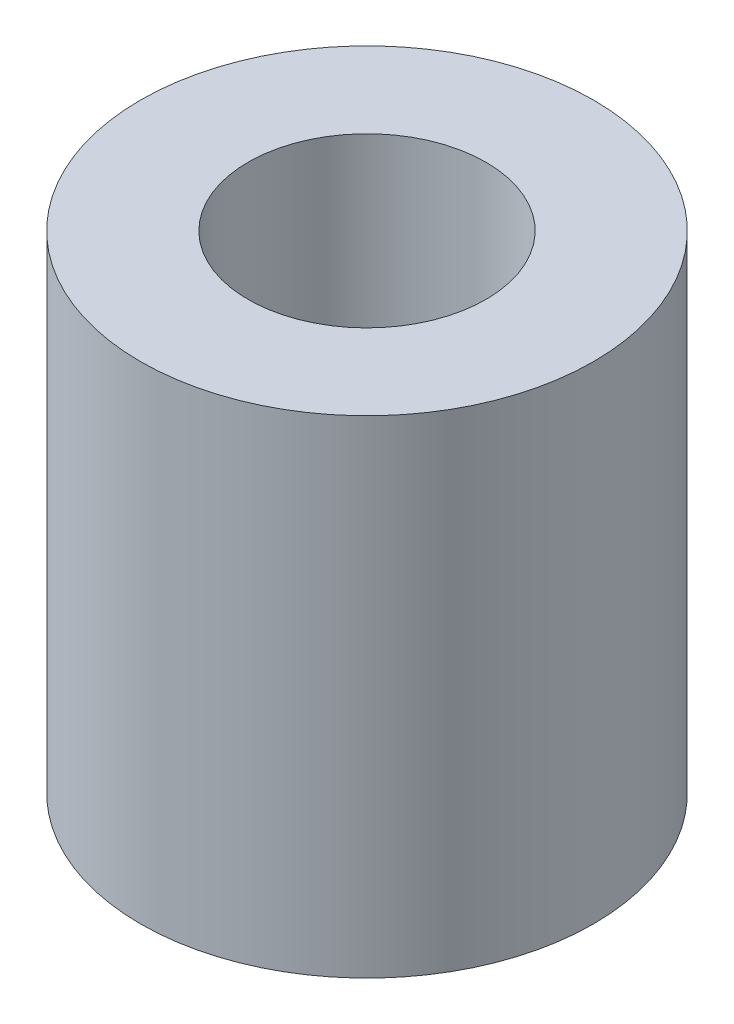
ISO-10303-21;
HEADER;
FILE_DESCRIPTION(('STEP AP214'),'2;1');
FILE_NAME('part.step','',(''),(''),'','','');
FILE_SCHEMA(('AUTOMOTIVE_DESIGN { 1 0 10303 214 1 1 1 1 }'));
ENDSEC;
DATA;
#1=APPLICATION_CONTEXT('core data for automotive mechanical design processes');
#2=APPLICATION_PROTOCOL_DEFINITION('international standard','automotive_design',2000,#1);
#3=PRODUCT_CONTEXT('',#1,'mechanical');
#4=PRODUCT('Part','Part','',(#3));
#5=PRODUCT_RELATED_PRODUCT_CATEGORY('part','',(#4));
#6=PRODUCT_DEFINITION_FORMATION('','',#4);
#7=PRODUCT_DEFINITION_CONTEXT('part definition',#1,'design');
#8=PRODUCT_DEFINITION('design','',#6,#7);
#9=PRODUCT_DEFINITION_SHAPE('','',#8);
#10=(LENGTH_UNIT() NAMED_UNIT(*) SI_UNIT(.MILLI.,.METRE.));
#11=(NAMED_UNIT(*) PLANE_ANGLE_UNIT() SI_UNIT($,.RADIAN.));
#12=(NAMED_UNIT(*) SI_UNIT($,.STERADIAN.) SOLID_ANGLE_UNIT());
#13=UNCERTAINTY_MEASURE_WITH_UNIT(LENGTH_MEASURE(1.E-05),#10,'distance_accuracy_value','');
#14=(GEOMETRIC_REPRESENTATION_CONTEXT(3) GLOBAL_UNCERTAINTY_ASSIGNED_CONTEXT((#13)) GLOBAL_UNIT_ASSIGNED_CONTEXT((#10,
#11,#12)) REPRESENTATION_CONTEXT('',''));
#15=CARTESIAN_POINT('',(0.,0.,0.));
#16=DIRECTION('',(0.,0.,1.));
#17=DIRECTION('',(1.,0.,0.));
#18=AXIS2_PLACEMENT_3D('',#15,#16,#17);
#19=CARTESIAN_POINT('',(0.,8.6,0.));
#20=DIRECTION('',(0.,1.,0.));
#21=DIRECTION('',(0.,0.,1.));
#22=AXIS2_PLACEMENT_3D('',#19,#20,#21);
#23=PLANE('',#22);
#24=CARTESIAN_POINT('',(0.,8.6,0.));
#25=DIRECTION('',(0.,1.,0.));
#26=DIRECTION('',(0.,0.,1.));
#27=AXIS2_PLACEMENT_3D('',#24,#25,#26);
#28=CIRCLE('',#27,4.);
#29=CARTESIAN_POINT('',(0.,8.6,-4.));
#30=VERTEX_POINT('',#29);
#31=EDGE_CURVE('E10',#30,#30,#28,.T.);
#32=ORIENTED_EDGE('',*,*,#31,.T.);
#33=EDGE_LOOP('',(#32));
#34=FACE_BOUND('',#33,.T.);
#35=CARTESIAN_POINT('',(0.,8.6,0.));
#36=DIRECTION('',(0.,1.,0.));
#37=DIRECTION('',(0.,0.,1.));
#38=AXIS2_PLACEMENT_3D('',#35,#36,#37);
#39=CIRCLE('',#38,2.1);
#40=CARTESIAN_POINT('',(0.,8.6,-2.1));
#41=VERTEX_POINT('',#40);
#42=EDGE_CURVE('E45',#41,#41,#39,.T.);
#43=ORIENTED_EDGE('',*,*,#42,.F.);
#44=EDGE_LOOP('',(#43));
#45=FACE_BOUND('',#44,.T.);
#46=ADVANCED_FACE('F34',(#34,#45),#23,.T.);
#47=CARTESIAN_POINT('',(0.,0.,0.));
#48=DIRECTION('',(0.,1.,0.));
#49=DIRECTION('',(0.,0.,1.));
#50=AXIS2_PLACEMENT_3D('',#47,#48,#49);
#51=PLANE('',#50);
#52=CARTESIAN_POINT('',(0.,0.,0.));
#53=DIRECTION('',(0.,1.,0.));
#54=DIRECTION('',(0.,0.,1.));
#55=AXIS2_PLACEMENT_3D('',#52,#53,#54);
#56=CIRCLE('',#55,4.);
#57=CARTESIAN_POINT('',(0.,0.,-4.));
#58=VERTEX_POINT('',#57);
#59=EDGE_CURVE('E38',#58,#58,#56,.T.);
#60=ORIENTED_EDGE('',*,*,#59,.F.);
#61=EDGE_LOOP('',(#60));
#62=FACE_BOUND('',#61,.T.);
#63=CARTESIAN_POINT('',(0.,0.,0.));
#64=DIRECTION('',(0.,1.,0.));
#65=DIRECTION('',(0.,0.,1.));
#66=AXIS2_PLACEMENT_3D('',#63,#64,#65);
#67=CIRCLE('',#66,2.1);
#68=CARTESIAN_POINT('',(0.,0.,-2.1));
#69=VERTEX_POINT('',#68);
#70=EDGE_CURVE('E47',#69,#69,#67,.T.);
#71=ORIENTED_EDGE('',*,*,#70,.T.);
#72=EDGE_LOOP('',(#71));
#73=FACE_BOUND('',#72,.T.);
#74=ADVANCED_FACE('F57',(#62,#73),#51,.F.);
#75=CARTESIAN_POINT('',(0.,8.6,0.));
#76=DIRECTION('',(0.,-1.,0.));
#77=DIRECTION('',(0.,0.,-1.));
#78=AXIS2_PLACEMENT_3D('',#75,#76,#77);
#79=CYLINDRICAL_SURFACE('',#78,4.);
#80=CARTESIAN_POINT('',(0.,8.6,-4.));
#81=CARTESIAN_POINT('',(0.,8.51041666666667,-4.));
#82=CARTESIAN_POINT('',(0.,8.42083333333333,-4.));
#83=CARTESIAN_POINT('',(0.,8.24166666666667,-4.));
#84=CARTESIAN_POINT('',(0.,8.15208333333333,-4.));
#85=CARTESIAN_POINT('',(0.,7.97291666666666,-4.));
#86=CARTESIAN_POINT('',(0.,7.88333333333333,-4.));
#87=CARTESIAN_POINT('',(0.,7.70416666666667,-4.));
#88=CARTESIAN_POINT('',(0.,7.61458333333333,-4.));
#89=CARTESIAN_POINT('',(0.,7.43541666666667,-4.));
#90=CARTESIAN_POINT('',(0.,7.34583333333333,-4.));
#91=CARTESIAN_POINT('',(0.,7.16666666666667,-4.));
#92=CARTESIAN_POINT('',(0.,7.07708333333333,-4.));
#93=CARTESIAN_POINT('',(0.,6.89791666666667,-4.));
#94=CARTESIAN_POINT('',(0.,6.80833333333333,-4.));
#95=CARTESIAN_POINT('',(0.,6.62916666666667,-4.));
#96=CARTESIAN_POINT('',(0.,6.53958333333333,-4.));
#97=CARTESIAN_POINT('',(0.,6.36041666666667,-4.));
#98=CARTESIAN_POINT('',(0.,6.27083333333333,-4.));
#99=CARTESIAN_POINT('',(0.,6.09166666666667,-4.));
#100=CARTESIAN_POINT('',(0.,6.00208333333333,-4.));
#101=CARTESIAN_POINT('',(0.,5.82291666666666,-4.));
#102=CARTESIAN_POINT('',(0.,5.73333333333333,-4.));
#103=CARTESIAN_POINT('',(0.,5.55416666666666,-4.));
#104=CARTESIAN_POINT('',(0.,5.46458333333333,-4.));
#105=CARTESIAN_POINT('',(0.,5.28541666666666,-4.));
#106=CARTESIAN_POINT('',(0.,5.19583333333333,-4.));
#107=CARTESIAN_POINT('',(0.,5.01666666666666,-4.));
#108=CARTESIAN_POINT('',(0.,4.92708333333333,-4.));
#109=CARTESIAN_POINT('',(0.,4.74791666666667,-4.));
#110=CARTESIAN_POINT('',(0.,4.65833333333333,-4.));
#111=CARTESIAN_POINT('',(0.,4.47916666666667,-4.));
#112=CARTESIAN_POINT('',(0.,4.38958333333333,-4.));
#113=CARTESIAN_POINT('',(0.,4.21041666666667,-4.));
#114=CARTESIAN_POINT('',(0.,4.12083333333333,-4.));
#115=CARTESIAN_POINT('',(0.,3.94166666666667,-4.));
#116=CARTESIAN_POINT('',(0.,3.85208333333333,-4.));
#117=CARTESIAN_POINT('',(0.,3.67291666666666,-4.));
#118=CARTESIAN_POINT('',(0.,3.58333333333333,-4.));
#119=CARTESIAN_POINT('',(0.,3.40416666666666,-4.));
#120=CARTESIAN_POINT('',(0.,3.31458333333333,-4.));
#121=CARTESIAN_POINT('',(0.,3.13541666666666,-4.));
#122=CARTESIAN_POINT('',(0.,3.04583333333333,-4.));
#123=CARTESIAN_POINT('',(0.,2.86666666666666,-4.));
#124=CARTESIAN_POINT('',(0.,2.77708333333333,-4.));
#125=CARTESIAN_POINT('',(0.,2.59791666666666,-4.));
#126=CARTESIAN_POINT('',(0.,2.50833333333333,-4.));
#127=CARTESIAN_POINT('',(0.,2.32916666666666,-4.));
#128=CARTESIAN_POINT('',(0.,2.23958333333333,-4.));
#129=CARTESIAN_POINT('',(0.,2.06041666666666,-4.));
#130=CARTESIAN_POINT('',(0.,1.97083333333333,-4.));
#131=CARTESIAN_POINT('',(0.,1.79166666666666,-4.));
#132=CARTESIAN_POINT('',(0.,1.70208333333333,-4.));
#133=CARTESIAN_POINT('',(0.,1.52291666666666,-4.));
#134=CARTESIAN_POINT('',(0.,1.43333333333333,-4.));
#135=CARTESIAN_POINT('',(0.,1.25416666666666,-4.));
#136=CARTESIAN_POINT('',(0.,1.16458333333333,-4.));
#137=CARTESIAN_POINT('',(0.,0.985416666666664,-4.));
#138=CARTESIAN_POINT('',(0.,0.89583333333333,-4.));
#139=CARTESIAN_POINT('',(0.,0.716666666666664,-4.));
#140=CARTESIAN_POINT('',(0.,0.627083333333331,-4.));
#141=CARTESIAN_POINT('',(0.,0.447916666666665,-4.));
#142=CARTESIAN_POINT('',(0.,0.358333333333331,-4.));
#143=CARTESIAN_POINT('',(0.,0.179166666666665,-4.));
#144=CARTESIAN_POINT('',(0.,0.0895833333333316,-4.));
#145=CARTESIAN_POINT('',(0.,0.,-4.));
#146=B_SPLINE_CURVE_WITH_KNOTS('',3,(#80,#81,#82,#83,#84,#85,#86,#87,#88,#89,#90,#91,#92,#93,
#94,#95,#96,#97,#98,#99,#100,#101,#102,#103,#104,#105,#106,#107,#108,#109,#110,#111,#112,#113,
#114,#115,#116,#117,#118,#119,#120,#121,#122,#123,#124,#125,#126,#127,#128,#129,#130,#131,#132,
#133,#134,#135,#136,#137,#138,#139,#140,#141,#142,#143,#144,#145),.UNSPECIFIED.,.F.,.F.,(4,2,2,
2,2,2,2,2,2,2,2,2,2,2,2,2,2,2,2,2,2,2,2,2,2,2,2,2,2,2,2,2,4),(0.,0.268750000000002,
0.537500000000002,0.806250000000001,1.075,1.34375,1.6125,1.88125,2.15,2.41875,2.6875,2.95625,
3.225,3.49375,3.7625,4.03125,4.3,4.56875,4.8375,5.10625,5.375,5.64375,5.9125,6.18125,6.45,
6.71875,6.9875,7.25625,7.525,7.79375,8.0625,8.33125,8.6),.UNSPECIFIED.);
#147=EDGE_CURVE('BSEAM36',#30,#58,#146,.T.);
#148=ORIENTED_EDGE('',*,*,#31,.F.);
#149=ORIENTED_EDGE('',*,*,#59,.T.);
#150=ORIENTED_EDGE('',*,*,#147,.T.);
#151=ORIENTED_EDGE('',*,*,#147,.F.);
#152=EDGE_LOOP('',(#148,#150,#149,#151));
#153=FACE_BOUND('',#152,.T.);
#154=ADVANCED_FACE('F36',(#153),#79,.T.);
#155=CARTESIAN_POINT('',(0.,8.6,0.));
#156=DIRECTION('',(0.,-1.,0.));
#157=DIRECTION('',(0.,0.,-1.));
#158=AXIS2_PLACEMENT_3D('',#155,#156,#157);
#159=CYLINDRICAL_SURFACE('',#158,2.1);
#160=CARTESIAN_POINT('',(0.,8.6,-2.1));
#161=CARTESIAN_POINT('',(0.,8.51041666666666,-2.1));
#162=CARTESIAN_POINT('',(0.,8.42083333333333,-2.1));
#163=CARTESIAN_POINT('',(0.,8.24166666666667,-2.1));
#164=CARTESIAN_POINT('',(0.,8.15208333333333,-2.1));
#165=CARTESIAN_POINT('',(0.,7.97291666666667,-2.1));
#166=CARTESIAN_POINT('',(0.,7.88333333333333,-2.1));
#167=CARTESIAN_POINT('',(0.,7.70416666666667,-2.1));
#168=CARTESIAN_POINT('',(0.,7.61458333333333,-2.1));
#169=CARTESIAN_POINT('',(0.,7.43541666666667,-2.1));
#170=CARTESIAN_POINT('',(0.,7.34583333333333,-2.1));
#171=CARTESIAN_POINT('',(0.,7.16666666666667,-2.1));
#172=CARTESIAN_POINT('',(0.,7.07708333333333,-2.1));
#173=CARTESIAN_POINT('',(0.,6.89791666666667,-2.1));
#174=CARTESIAN_POINT('',(0.,6.80833333333333,-2.1));
#175=CARTESIAN_POINT('',(0.,6.62916666666667,-2.1));
#176=CARTESIAN_POINT('',(0.,6.53958333333333,-2.1));
#177=CARTESIAN_POINT('',(0.,6.36041666666667,-2.1));
#178=CARTESIAN_POINT('',(0.,6.27083333333333,-2.1));
#179=CARTESIAN_POINT('',(0.,6.09166666666667,-2.1));
#180=CARTESIAN_POINT('',(0.,6.00208333333333,-2.1));
#181=CARTESIAN_POINT('',(0.,5.82291666666667,-2.1));
#182=CARTESIAN_POINT('',(0.,5.73333333333333,-2.1));
#183=CARTESIAN_POINT('',(0.,5.55416666666667,-2.1));
#184=CARTESIAN_POINT('',(0.,5.46458333333333,-2.1));
#185=CARTESIAN_POINT('',(0.,5.28541666666667,-2.1));
#186=CARTESIAN_POINT('',(0.,5.19583333333333,-2.1));
#187=CARTESIAN_POINT('',(0.,5.01666666666667,-2.1));
#188=CARTESIAN_POINT('',(0.,4.92708333333333,-2.1));
#189=CARTESIAN_POINT('',(0.,4.74791666666667,-2.1));
#190=CARTESIAN_POINT('',(0.,4.65833333333333,-2.1));
#191=CARTESIAN_POINT('',(0.,4.47916666666667,-2.1));
#192=CARTESIAN_POINT('',(0.,4.38958333333333,-2.1));
#193=CARTESIAN_POINT('',(0.,4.21041666666667,-2.1));
#194=CARTESIAN_POINT('',(0.,4.12083333333333,-2.1));
#195=CARTESIAN_POINT('',(0.,3.94166666666667,-2.1));
#196=CARTESIAN_POINT('',(0.,3.85208333333333,-2.1));
#197=CARTESIAN_POINT('',(0.,3.67291666666667,-2.1));
#198=CARTESIAN_POINT('',(0.,3.58333333333333,-2.1));
#199=CARTESIAN_POINT('',(0.,3.40416666666667,-2.1));
#200=CARTESIAN_POINT('',(0.,3.31458333333333,-2.1));
#201=CARTESIAN_POINT('',(0.,3.13541666666667,-2.1));
#202=CARTESIAN_POINT('',(0.,3.04583333333333,-2.1));
#203=CARTESIAN_POINT('',(0.,2.86666666666667,-2.1));
#204=CARTESIAN_POINT('',(0.,2.77708333333333,-2.1));
#205=CARTESIAN_POINT('',(0.,2.59791666666667,-2.1));
#206=CARTESIAN_POINT('',(0.,2.50833333333333,-2.1));
#207=CARTESIAN_POINT('',(0.,2.32916666666667,-2.1));
#208=CARTESIAN_POINT('',(0.,2.23958333333333,-2.1));
#209=CARTESIAN_POINT('',(0.,2.06041666666667,-2.1));
#210=CARTESIAN_POINT('',(0.,1.97083333333333,-2.1));
#211=CARTESIAN_POINT('',(0.,1.79166666666667,-2.1));
#212=CARTESIAN_POINT('',(0.,1.70208333333333,-2.1));
#213=CARTESIAN_POINT('',(0.,1.52291666666667,-2.1));
#214=CARTESIAN_POINT('',(0.,1.43333333333333,-2.1));
#215=CARTESIAN_POINT('',(0.,1.25416666666667,-2.1));
#216=CARTESIAN_POINT('',(0.,1.16458333333333,-2.1));
#217=CARTESIAN_POINT('',(0.,0.985416666666665,-2.1));
#218=CARTESIAN_POINT('',(0.,0.895833333333332,-2.1));
#219=CARTESIAN_POINT('',(0.,0.716666666666665,-2.1));
#220=CARTESIAN_POINT('',(0.,0.627083333333332,-2.1));
#221=CARTESIAN_POINT('',(0.,0.447916666666665,-2.1));
#222=CARTESIAN_POINT('',(0.,0.358333333333331,-2.1));
#223=CARTESIAN_POINT('',(0.,0.179166666666665,-2.1));
#224=CARTESIAN_POINT('',(0.,0.0895833333333315,-2.1));
#225=CARTESIAN_POINT('',(0.,0.,-2.1));
#226=B_SPLINE_CURVE_WITH_KNOTS('',3,(#160,#161,#162,#163,#164,#165,#166,#167,#168,#169,#170,
#171,#172,#173,#174,#175,#176,#177,#178,#179,#180,#181,#182,#183,#184,#185,#186,#187,#188,#189,
#190,#191,#192,#193,#194,#195,#196,#197,#198,#199,#200,#201,#202,#203,#204,#205,#206,#207,#208,
#209,#210,#211,#212,#213,#214,#215,#216,#217,#218,#219,#220,#221,#222,#223,#224,#225),
.UNSPECIFIED.,.F.,.F.,(4,2,2,2,2,2,2,2,2,2,2,2,2,2,2,2,2,2,2,2,2,2,2,2,2,2,2,2,2,2,2,2,4),(0.,
0.26875,0.5375,0.806249999999999,1.075,1.34375,1.6125,1.88125,2.15,2.41875,2.6875,2.95625,3.225,
3.49375,3.7625,4.03125,4.3,4.56875,4.8375,5.10625,5.375,5.64375,5.9125,6.18125,6.45,6.71875,
6.9875,7.25625,7.525,7.79375,8.0625,8.33125,8.6),.UNSPECIFIED.);
#227=EDGE_CURVE('BSEAM53',#41,#69,#226,.T.);
#228=ORIENTED_EDGE('',*,*,#42,.T.);
#229=ORIENTED_EDGE('',*,*,#70,.F.);
#230=ORIENTED_EDGE('',*,*,#227,.T.);
#231=ORIENTED_EDGE('',*,*,#227,.F.);
#232=EDGE_LOOP('',(#228,#230,#229,#231));
#233=FACE_BOUND('',#232,.T.);
#234=ADVANCED_FACE('F53',(#233),#159,.F.);
#235=CLOSED_SHELL('',(#46,#74,#154,#234));
#236=MANIFOLD_SOLID_BREP('B2',#235);
#237=ADVANCED_BREP_SHAPE_REPRESENTATION('',(#18,#236),#14);
#238=SHAPE_DEFINITION_REPRESENTATION(#9,#237);
ENDSEC;
END-ISO-10303-21;
